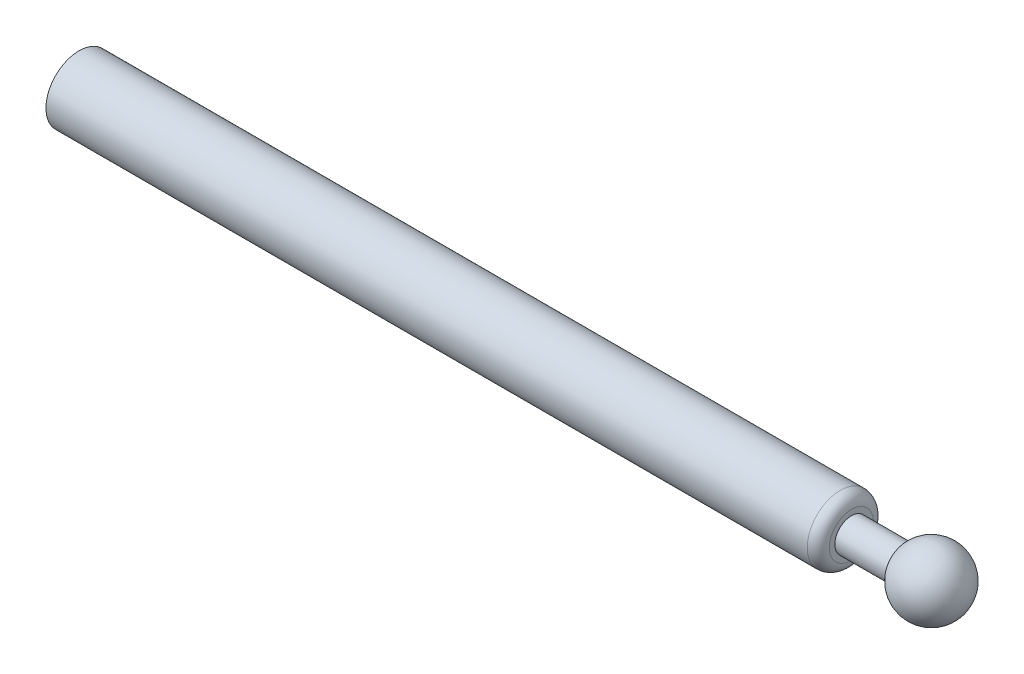
ISO-10303-21;
HEADER;
FILE_DESCRIPTION(('STEP AP214'),'2;1');
FILE_NAME('part.step','',(''),(''),'','','');
FILE_SCHEMA(('AUTOMOTIVE_DESIGN { 1 0 10303 214 1 1 1 1 }'));
ENDSEC;
DATA;
#1=APPLICATION_CONTEXT('core data for automotive mechanical design processes');
#2=APPLICATION_PROTOCOL_DEFINITION('international standard','automotive_design',2000,#1);
#3=PRODUCT_CONTEXT('',#1,'mechanical');
#4=PRODUCT('Part','Part','',(#3));
#5=PRODUCT_RELATED_PRODUCT_CATEGORY('part','',(#4));
#6=PRODUCT_DEFINITION_FORMATION('','',#4);
#7=PRODUCT_DEFINITION_CONTEXT('part definition',#1,'design');
#8=PRODUCT_DEFINITION('design','',#6,#7);
#9=PRODUCT_DEFINITION_SHAPE('','',#8);
#10=(LENGTH_UNIT() NAMED_UNIT(*) SI_UNIT(.MILLI.,.METRE.));
#11=(NAMED_UNIT(*) PLANE_ANGLE_UNIT() SI_UNIT($,.RADIAN.));
#12=(NAMED_UNIT(*) SI_UNIT($,.STERADIAN.) SOLID_ANGLE_UNIT());
#13=UNCERTAINTY_MEASURE_WITH_UNIT(LENGTH_MEASURE(1.E-05),#10,'distance_accuracy_value','');
#14=(GEOMETRIC_REPRESENTATION_CONTEXT(3) GLOBAL_UNCERTAINTY_ASSIGNED_CONTEXT((#13)) GLOBAL_UNIT_ASSIGNED_CONTEXT((#10,
#11,#12)) REPRESENTATION_CONTEXT('',''));
#15=CARTESIAN_POINT('',(0.,0.,0.));
#16=DIRECTION('',(0.,0.,1.));
#17=DIRECTION('',(1.,0.,0.));
#18=AXIS2_PLACEMENT_3D('',#15,#16,#17);
#19=CARTESIAN_POINT('',(70.,0.,0.));
#20=DIRECTION('',(-1.,0.,0.));
#21=DIRECTION('',(0.,0.,1.));
#22=AXIS2_PLACEMENT_3D('',#19,#20,#21);
#23=CYLINDRICAL_SURFACE('',#22,3.);
#24=CARTESIAN_POINT('',(69.,0.,0.));
#25=DIRECTION('',(1.,0.,0.));
#26=DIRECTION('',(0.,0.,-1.));
#27=AXIS2_PLACEMENT_3D('',#24,#25,#26);
#28=CIRCLE('',#27,3.);
#29=CARTESIAN_POINT('',(69.,0.,-3.));
#30=VERTEX_POINT('',#29);
#31=EDGE_CURVE('E10',#30,#30,#28,.F.);
#32=ORIENTED_EDGE('',*,*,#31,.T.);
#33=EDGE_LOOP('',(#32));
#34=FACE_BOUND('',#33,.T.);
#35=CARTESIAN_POINT('',(0.,0.,0.));
#36=DIRECTION('',(1.,0.,0.));
#37=DIRECTION('',(0.,0.,-1.));
#38=AXIS2_PLACEMENT_3D('',#35,#36,#37);
#39=CIRCLE('',#38,3.);
#40=CARTESIAN_POINT('',(0.,0.,-3.));
#41=VERTEX_POINT('',#40);
#42=EDGE_CURVE('E49',#41,#41,#39,.T.);
#43=ORIENTED_EDGE('',*,*,#42,.T.);
#44=EDGE_LOOP('',(#43));
#45=FACE_BOUND('',#44,.T.);
#46=ADVANCED_FACE('F34',(#34,#45),#23,.T.);
#47=CARTESIAN_POINT('',(70.,0.,0.));
#48=DIRECTION('',(1.,0.,0.));
#49=DIRECTION('',(0.,0.,-1.));
#50=AXIS2_PLACEMENT_3D('',#47,#48,#49);
#51=PLANE('',#50);
#52=CARTESIAN_POINT('',(70.,0.,0.));
#53=DIRECTION('',(1.,0.,0.));
#54=DIRECTION('',(0.,0.,-1.));
#55=AXIS2_PLACEMENT_3D('',#52,#53,#54);
#56=CIRCLE('',#55,2.);
#57=CARTESIAN_POINT('',(70.,0.,-2.));
#58=VERTEX_POINT('',#57);
#59=EDGE_CURVE('E42',#58,#58,#56,.T.);
#60=ORIENTED_EDGE('',*,*,#59,.T.);
#61=EDGE_LOOP('',(#60));
#62=FACE_BOUND('',#61,.T.);
#63=CARTESIAN_POINT('',(70.,0.,0.));
#64=DIRECTION('',(1.,0.,0.));
#65=DIRECTION('',(0.,0.,-1.));
#66=AXIS2_PLACEMENT_3D('',#63,#64,#65);
#67=CIRCLE('',#66,1.5);
#68=CARTESIAN_POINT('',(70.,0.,-1.5));
#69=VERTEX_POINT('',#68);
#70=EDGE_CURVE('E46',#69,#69,#67,.T.);
#71=ORIENTED_EDGE('',*,*,#70,.F.);
#72=EDGE_LOOP('',(#71));
#73=FACE_BOUND('',#72,.T.);
#74=ADVANCED_FACE('F57',(#62,#73),#51,.T.);
#75=CARTESIAN_POINT('',(0.,0.,0.));
#76=DIRECTION('',(1.,0.,0.));
#77=DIRECTION('',(0.,0.,-1.));
#78=AXIS2_PLACEMENT_3D('',#75,#76,#77);
#79=PLANE('',#78);
#80=ORIENTED_EDGE('',*,*,#42,.F.);
#81=EDGE_LOOP('',(#80));
#82=FACE_BOUND('',#81,.T.);
#83=ADVANCED_FACE('F59',(#82),#79,.F.);
#84=CARTESIAN_POINT('',(75.,0.,0.));
#85=DIRECTION('',(-1.,0.,0.));
#86=DIRECTION('',(0.,0.,1.));
#87=AXIS2_PLACEMENT_3D('',#84,#85,#86);
#88=CYLINDRICAL_SURFACE('',#87,1.5);
#89=CARTESIAN_POINT('',(74.6519237886467,0.,0.));
#90=DIRECTION('',(0.999999999999998,0.,0.));
#91=DIRECTION('',(0.,0.,-1.));
#92=AXIS2_PLACEMENT_3D('',#89,#90,#91);
#93=CIRCLE('',#92,1.5);
#94=CARTESIAN_POINT('',(74.6519237886467,0.,-1.5));
#95=VERTEX_POINT('',#94);
#96=EDGE_CURVE('E38',#95,#95,#93,.F.);
#97=ORIENTED_EDGE('',*,*,#96,.T.);
#98=EDGE_LOOP('',(#97));
#99=FACE_BOUND('',#98,.T.);
#100=ORIENTED_EDGE('',*,*,#70,.T.);
#101=EDGE_LOOP('',(#100));
#102=FACE_BOUND('',#101,.T.);
#103=ADVANCED_FACE('F55',(#99,#102),#88,.T.);
#104=CARTESIAN_POINT('',(69.,0.,0.));
#105=DIRECTION('',(1.,0.,0.));
#106=DIRECTION('',(0.,0.,-1.));
#107=AXIS2_PLACEMENT_3D('',#104,#105,#106);
#108=TOROIDAL_SURFACE('',#107,2.,1.);
#109=ORIENTED_EDGE('',*,*,#31,.F.);
#110=EDGE_LOOP('',(#109));
#111=FACE_BOUND('',#110,.T.);
#112=ORIENTED_EDGE('',*,*,#59,.F.);
#113=EDGE_LOOP('',(#112));
#114=FACE_BOUND('',#113,.T.);
#115=ADVANCED_FACE('F36',(#111,#114),#108,.T.);
#116=CARTESIAN_POINT('',(77.25,0.,0.));
#117=DIRECTION('',(-1.,0.,0.));
#118=DIRECTION('',(0.,1.,0.));
#119=AXIS2_PLACEMENT_3D('',#116,#117,#118);
#120=SPHERICAL_SURFACE('',#119,3.);
#121=ORIENTED_EDGE('',*,*,#96,.F.);
#122=EDGE_LOOP('',(#121));
#123=FACE_BOUND('',#122,.T.);
#124=ADVANCED_FACE('F72',(#123),#120,.T.);
#125=CLOSED_SHELL('',(#46,#74,#83,#103,#115,#124));
#126=MANIFOLD_SOLID_BREP('B2',#125);
#127=ADVANCED_BREP_SHAPE_REPRESENTATION('',(#18,#126),#14);
#128=SHAPE_DEFINITION_REPRESENTATION(#9,#127);
ENDSEC;
END-ISO-10303-21;
